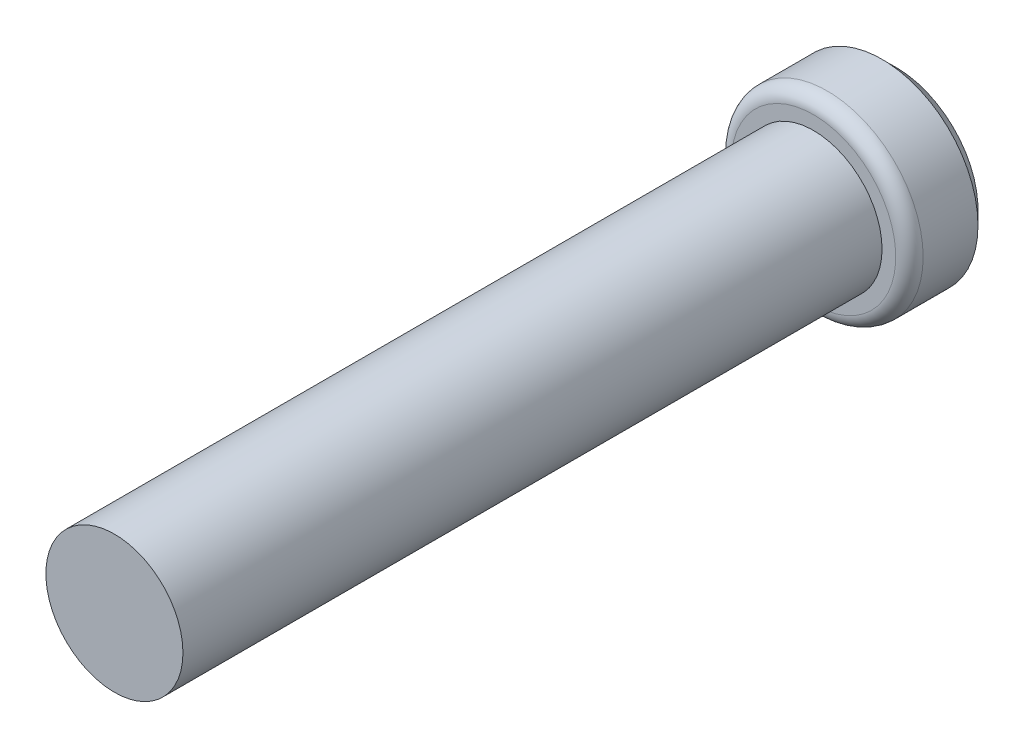
ISO-10303-21;
HEADER;
FILE_DESCRIPTION(('STEP AP214'),'2;1');
FILE_NAME('part.step','',(''),(''),'','','');
FILE_SCHEMA(('AUTOMOTIVE_DESIGN { 1 0 10303 214 1 1 1 1 }'));
ENDSEC;
DATA;
#1=APPLICATION_CONTEXT('core data for automotive mechanical design processes');
#2=APPLICATION_PROTOCOL_DEFINITION('international standard','automotive_design',2000,#1);
#3=PRODUCT_CONTEXT('',#1,'mechanical');
#4=PRODUCT('Part','Part','',(#3));
#5=PRODUCT_RELATED_PRODUCT_CATEGORY('part','',(#4));
#6=PRODUCT_DEFINITION_FORMATION('','',#4);
#7=PRODUCT_DEFINITION_CONTEXT('part definition',#1,'design');
#8=PRODUCT_DEFINITION('design','',#6,#7);
#9=PRODUCT_DEFINITION_SHAPE('','',#8);
#10=(LENGTH_UNIT() NAMED_UNIT(*) SI_UNIT(.MILLI.,.METRE.));
#11=(NAMED_UNIT(*) PLANE_ANGLE_UNIT() SI_UNIT($,.RADIAN.));
#12=(NAMED_UNIT(*) SI_UNIT($,.STERADIAN.) SOLID_ANGLE_UNIT());
#13=UNCERTAINTY_MEASURE_WITH_UNIT(LENGTH_MEASURE(1.E-05),#10,'distance_accuracy_value','');
#14=(GEOMETRIC_REPRESENTATION_CONTEXT(3) GLOBAL_UNCERTAINTY_ASSIGNED_CONTEXT((#13)) GLOBAL_UNIT_ASSIGNED_CONTEXT((#10,
#11,#12)) REPRESENTATION_CONTEXT('',''));
#15=CARTESIAN_POINT('',(0.,0.,0.));
#16=DIRECTION('',(0.,0.,1.));
#17=DIRECTION('',(1.,0.,0.));
#18=AXIS2_PLACEMENT_3D('',#15,#16,#17);
#19=CARTESIAN_POINT('',(0.,0.,25.5));
#20=DIRECTION('',(0.,0.,-1.));
#21=DIRECTION('',(-1.,0.,0.));
#22=AXIS2_PLACEMENT_3D('',#19,#20,#21);
#23=CYLINDRICAL_SURFACE('',#22,2.5);
#24=CARTESIAN_POINT('',(0.,0.,25.5));
#25=DIRECTION('',(0.,0.,1.));
#26=DIRECTION('',(1.,0.,0.));
#27=AXIS2_PLACEMENT_3D('',#24,#25,#26);
#28=CIRCLE('',#27,2.5);
#29=CARTESIAN_POINT('',(2.5,0.,25.5));
#30=VERTEX_POINT('',#29);
#31=EDGE_CURVE('E144',#30,#30,#28,.T.);
#32=ORIENTED_EDGE('',*,*,#31,.F.);
#33=EDGE_LOOP('',(#32));
#34=FACE_BOUND('',#33,.T.);
#35=CARTESIAN_POINT('',(0.,0.,0.));
#36=DIRECTION('',(0.,0.,1.));
#37=DIRECTION('',(1.,0.,0.));
#38=AXIS2_PLACEMENT_3D('',#35,#36,#37);
#39=CIRCLE('',#38,2.5);
#40=CARTESIAN_POINT('',(2.5,0.,0.));
#41=VERTEX_POINT('',#40);
#42=EDGE_CURVE('E138',#41,#41,#39,.T.);
#43=ORIENTED_EDGE('',*,*,#42,.T.);
#44=EDGE_LOOP('',(#43));
#45=FACE_BOUND('',#44,.T.);
#46=ADVANCED_FACE('F36',(#34,#45),#23,.T.);
#47=CARTESIAN_POINT('',(0.,0.,25.5));
#48=DIRECTION('',(0.,0.,1.));
#49=DIRECTION('',(1.,0.,0.));
#50=AXIS2_PLACEMENT_3D('',#47,#48,#49);
#51=PLANE('',#50);
#52=ORIENTED_EDGE('',*,*,#31,.T.);
#53=EDGE_LOOP('',(#52));
#54=FACE_BOUND('',#53,.T.);
#55=ADVANCED_FACE('F169',(#54),#51,.T.);
#56=CARTESIAN_POINT('',(0.,0.,-3.));
#57=DIRECTION('',(0.,0.,1.));
#58=DIRECTION('',(1.,0.,0.));
#59=AXIS2_PLACEMENT_3D('',#56,#57,#58);
#60=CYLINDRICAL_SURFACE('',#59,3.5);
#61=CARTESIAN_POINT('',(0.,0.,-0.5));
#62=DIRECTION('',(0.,0.,-1.));
#63=DIRECTION('',(-1.,0.,0.));
#64=AXIS2_PLACEMENT_3D('',#61,#62,#63);
#65=CIRCLE('',#64,3.5);
#66=CARTESIAN_POINT('',(-3.5,0.,-0.5));
#67=VERTEX_POINT('',#66);
#68=EDGE_CURVE('E44',#67,#67,#65,.T.);
#69=ORIENTED_EDGE('',*,*,#68,.T.);
#70=EDGE_LOOP('',(#69));
#71=FACE_BOUND('',#70,.T.);
#72=CARTESIAN_POINT('',(0.,0.,-2.5));
#73=DIRECTION('',(0.,0.,-1.));
#74=DIRECTION('',(-1.,0.,0.));
#75=AXIS2_PLACEMENT_3D('',#72,#73,#74);
#76=CIRCLE('',#75,3.5);
#77=CARTESIAN_POINT('',(-3.5,0.,-2.5));
#78=VERTEX_POINT('',#77);
#79=EDGE_CURVE('E152',#78,#78,#76,.F.);
#80=ORIENTED_EDGE('',*,*,#79,.T.);
#81=EDGE_LOOP('',(#80));
#82=FACE_BOUND('',#81,.T.);
#83=ADVANCED_FACE('F157',(#71,#82),#60,.T.);
#84=CARTESIAN_POINT('',(0.,0.,-3.));
#85=DIRECTION('',(0.,0.,-1.));
#86=DIRECTION('',(-1.,0.,0.));
#87=AXIS2_PLACEMENT_3D('',#84,#85,#86);
#88=PLANE('',#87);
#89=CARTESIAN_POINT('',(0.,0.,-3.));
#90=DIRECTION('',(0.,0.,-1.));
#91=DIRECTION('',(-1.,0.,0.));
#92=AXIS2_PLACEMENT_3D('',#89,#90,#91);
#93=CIRCLE('',#92,3.);
#94=CARTESIAN_POINT('',(-3.,0.,-3.));
#95=VERTEX_POINT('',#94);
#96=EDGE_CURVE('E147',#95,#95,#93,.T.);
#97=ORIENTED_EDGE('',*,*,#96,.T.);
#98=EDGE_LOOP('',(#97));
#99=FACE_BOUND('',#98,.T.);
#100=DIRECTION('',(-0.866025403784436,0.500000000000004,0.));
#101=VECTOR('',#100,1.);
#102=CARTESIAN_POINT('',(-1.09002923180361,-1.8879860112191,-3.));
#103=LINE('',#102,#101);
#104=CARTESIAN_POINT('',(0.,-2.51731468162548,-3.));
#105=VERTEX_POINT('',#104);
#106=CARTESIAN_POINT('',(-2.18005846360722,-1.25865734081272,-3.));
#107=VERTEX_POINT('',#106);
#108=EDGE_CURVE('E51',#105,#107,#103,.T.);
#109=ORIENTED_EDGE('',*,*,#108,.F.);
#110=DIRECTION('',(-0.86602540378444,-0.499999999999998,0.));
#111=VECTOR('',#110,1.);
#112=CARTESIAN_POINT('',(1.0900292318036,-1.88798601121912,-3.));
#113=LINE('',#112,#111);
#114=CARTESIAN_POINT('',(2.1800584636072,-1.25865734081275,-3.));
#115=VERTEX_POINT('',#114);
#116=EDGE_CURVE('E134',#115,#105,#113,.T.);
#117=ORIENTED_EDGE('',*,*,#116,.F.);
#118=DIRECTION('',(0.,-1.,0.));
#119=VECTOR('',#118,1.);
#120=CARTESIAN_POINT('',(2.1800584636072,0.,-3.));
#121=LINE('',#120,#119);
#122=CARTESIAN_POINT('',(2.18005846360721,1.25865734081274,-3.));
#123=VERTEX_POINT('',#122);
#124=EDGE_CURVE('E132',#123,#115,#121,.T.);
#125=ORIENTED_EDGE('',*,*,#124,.F.);
#126=DIRECTION('',(0.866025403784438,-0.500000000000001,0.));
#127=VECTOR('',#126,1.);
#128=CARTESIAN_POINT('',(1.0900292318036,1.88798601121911,-3.));
#129=LINE('',#128,#127);
#130=CARTESIAN_POINT('',(0.,2.51731468162548,-3.));
#131=VERTEX_POINT('',#130);
#132=EDGE_CURVE('E99',#131,#123,#129,.T.);
#133=ORIENTED_EDGE('',*,*,#132,.F.);
#134=DIRECTION('',(0.866025403784441,0.499999999999995,0.));
#135=VECTOR('',#134,1.);
#136=CARTESIAN_POINT('',(-1.0900292318036,1.88798601121912,-3.));
#137=LINE('',#136,#135);
#138=CARTESIAN_POINT('',(-2.18005846360719,1.25865734081277,-3.));
#139=VERTEX_POINT('',#138);
#140=EDGE_CURVE('E128',#139,#131,#137,.T.);
#141=ORIENTED_EDGE('',*,*,#140,.F.);
#142=DIRECTION('',(0.,1.,0.));
#143=VECTOR('',#142,1.);
#144=CARTESIAN_POINT('',(-2.1800584636072,0.,-3.));
#145=LINE('',#144,#143);
#146=EDGE_CURVE('E125',#107,#139,#145,.T.);
#147=ORIENTED_EDGE('',*,*,#146,.F.);
#148=EDGE_LOOP('',(#109,#117,#125,#133,#141,#147));
#149=FACE_BOUND('',#148,.T.);
#150=ADVANCED_FACE('F185',(#99,#149),#88,.T.);
#151=CARTESIAN_POINT('',(0.,0.,0.));
#152=DIRECTION('',(0.,0.,-1.));
#153=DIRECTION('',(-1.,0.,0.));
#154=AXIS2_PLACEMENT_3D('',#151,#152,#153);
#155=PLANE('',#154);
#156=CARTESIAN_POINT('',(0.,0.,0.));
#157=DIRECTION('',(0.,0.,-1.));
#158=DIRECTION('',(-1.,0.,0.));
#159=AXIS2_PLACEMENT_3D('',#156,#157,#158);
#160=CIRCLE('',#159,3.);
#161=CARTESIAN_POINT('',(-3.,0.,0.));
#162=VERTEX_POINT('',#161);
#163=EDGE_CURVE('E11',#162,#162,#160,.F.);
#164=ORIENTED_EDGE('',*,*,#163,.T.);
#165=EDGE_LOOP('',(#164));
#166=FACE_BOUND('',#165,.T.);
#167=ORIENTED_EDGE('',*,*,#42,.F.);
#168=EDGE_LOOP('',(#167));
#169=FACE_BOUND('',#168,.T.);
#170=ADVANCED_FACE('F186',(#166,#169),#155,.F.);
#171=CARTESIAN_POINT('',(-1.09002923180361,-1.8879860112191,-1.));
#172=DIRECTION('',(-0.500000000000004,-0.866025403784436,0.));
#173=DIRECTION('',(0.866025403784436,-0.500000000000004,0.));
#174=AXIS2_PLACEMENT_3D('',#171,#172,#173);
#175=PLANE('',#174);
#176=ORIENTED_EDGE('',*,*,#108,.T.);
#177=DIRECTION('',(0.,0.,-1.));
#178=VECTOR('',#177,1.);
#179=CARTESIAN_POINT('',(-2.18005846360722,-1.25865734081272,-1.));
#180=LINE('',#179,#178);
#181=CARTESIAN_POINT('',(-2.18005846360722,-1.25865734081272,-1.));
#182=VERTEX_POINT('',#181);
#183=EDGE_CURVE('E81',#182,#107,#180,.T.);
#184=ORIENTED_EDGE('',*,*,#183,.F.);
#185=DIRECTION('',(-0.866025403784436,0.500000000000004,0.));
#186=VECTOR('',#185,1.);
#187=CARTESIAN_POINT('',(-1.09002923180361,-1.8879860112191,-1.));
#188=LINE('',#187,#186);
#189=CARTESIAN_POINT('',(0.,-2.51731468162548,-1.));
#190=VERTEX_POINT('',#189);
#191=EDGE_CURVE('E136',#190,#182,#188,.T.);
#192=ORIENTED_EDGE('',*,*,#191,.F.);
#193=DIRECTION('',(0.,0.,-1.));
#194=VECTOR('',#193,1.);
#195=CARTESIAN_POINT('',(0.,-2.51731468162548,-1.));
#196=LINE('',#195,#194);
#197=EDGE_CURVE('E59',#190,#105,#196,.T.);
#198=ORIENTED_EDGE('',*,*,#197,.T.);
#199=EDGE_LOOP('',(#176,#184,#192,#198));
#200=FACE_BOUND('',#199,.T.);
#201=ADVANCED_FACE('F189',(#200),#175,.F.);
#202=CARTESIAN_POINT('',(1.0900292318036,-1.88798601121912,-1.));
#203=DIRECTION('',(0.499999999999998,-0.86602540378444,0.));
#204=DIRECTION('',(0.86602540378444,0.499999999999998,0.));
#205=AXIS2_PLACEMENT_3D('',#202,#203,#204);
#206=PLANE('',#205);
#207=ORIENTED_EDGE('',*,*,#116,.T.);
#208=ORIENTED_EDGE('',*,*,#197,.F.);
#209=DIRECTION('',(-0.86602540378444,-0.499999999999998,0.));
#210=VECTOR('',#209,1.);
#211=CARTESIAN_POINT('',(1.0900292318036,-1.88798601121912,-1.));
#212=LINE('',#211,#210);
#213=CARTESIAN_POINT('',(2.1800584636072,-1.25865734081275,-1.));
#214=VERTEX_POINT('',#213);
#215=EDGE_CURVE('E111',#214,#190,#212,.T.);
#216=ORIENTED_EDGE('',*,*,#215,.F.);
#217=DIRECTION('',(0.,0.,-1.));
#218=VECTOR('',#217,1.);
#219=CARTESIAN_POINT('',(2.1800584636072,-1.25865734081275,-1.));
#220=LINE('',#219,#218);
#221=EDGE_CURVE('E103',#214,#115,#220,.T.);
#222=ORIENTED_EDGE('',*,*,#221,.T.);
#223=EDGE_LOOP('',(#207,#208,#216,#222));
#224=FACE_BOUND('',#223,.T.);
#225=ADVANCED_FACE('F196',(#224),#206,.F.);
#226=CARTESIAN_POINT('',(2.1800584636072,0.,-1.));
#227=DIRECTION('',(1.,0.,0.));
#228=DIRECTION('',(0.,1.,0.));
#229=AXIS2_PLACEMENT_3D('',#226,#227,#228);
#230=PLANE('',#229);
#231=ORIENTED_EDGE('',*,*,#124,.T.);
#232=ORIENTED_EDGE('',*,*,#221,.F.);
#233=DIRECTION('',(0.,-1.,0.));
#234=VECTOR('',#233,1.);
#235=CARTESIAN_POINT('',(2.1800584636072,0.,-1.));
#236=LINE('',#235,#234);
#237=CARTESIAN_POINT('',(2.18005846360721,1.25865734081274,-1.));
#238=VERTEX_POINT('',#237);
#239=EDGE_CURVE('E107',#238,#214,#236,.T.);
#240=ORIENTED_EDGE('',*,*,#239,.F.);
#241=DIRECTION('',(0.,0.,-1.));
#242=VECTOR('',#241,1.);
#243=CARTESIAN_POINT('',(2.18005846360721,1.25865734081274,-1.));
#244=LINE('',#243,#242);
#245=EDGE_CURVE('E92',#238,#123,#244,.T.);
#246=ORIENTED_EDGE('',*,*,#245,.T.);
#247=EDGE_LOOP('',(#231,#232,#240,#246));
#248=FACE_BOUND('',#247,.T.);
#249=ADVANCED_FACE('F108',(#248),#230,.F.);
#250=CARTESIAN_POINT('',(1.0900292318036,1.88798601121911,-1.));
#251=DIRECTION('',(0.500000000000001,0.866025403784438,0.));
#252=DIRECTION('',(-0.866025403784438,0.500000000000001,0.));
#253=AXIS2_PLACEMENT_3D('',#250,#251,#252);
#254=PLANE('',#253);
#255=ORIENTED_EDGE('',*,*,#132,.T.);
#256=ORIENTED_EDGE('',*,*,#245,.F.);
#257=DIRECTION('',(0.866025403784438,-0.500000000000001,0.));
#258=VECTOR('',#257,1.);
#259=CARTESIAN_POINT('',(1.0900292318036,1.88798601121911,-1.));
#260=LINE('',#259,#258);
#261=CARTESIAN_POINT('',(0.,2.51731468162548,-1.));
#262=VERTEX_POINT('',#261);
#263=EDGE_CURVE('E96',#262,#238,#260,.T.);
#264=ORIENTED_EDGE('',*,*,#263,.F.);
#265=DIRECTION('',(0.,0.,-1.));
#266=VECTOR('',#265,1.);
#267=CARTESIAN_POINT('',(0.,2.51731468162548,-1.));
#268=LINE('',#267,#266);
#269=EDGE_CURVE('E104',#262,#131,#268,.T.);
#270=ORIENTED_EDGE('',*,*,#269,.T.);
#271=EDGE_LOOP('',(#255,#256,#264,#270));
#272=FACE_BOUND('',#271,.T.);
#273=ADVANCED_FACE('F94',(#272),#254,.F.);
#274=CARTESIAN_POINT('',(-1.0900292318036,1.88798601121912,-1.));
#275=DIRECTION('',(-0.499999999999995,0.866025403784441,0.));
#276=DIRECTION('',(-0.866025403784442,-0.499999999999995,0.));
#277=AXIS2_PLACEMENT_3D('',#274,#275,#276);
#278=PLANE('',#277);
#279=ORIENTED_EDGE('',*,*,#140,.T.);
#280=ORIENTED_EDGE('',*,*,#269,.F.);
#281=DIRECTION('',(0.866025403784441,0.499999999999995,0.));
#282=VECTOR('',#281,1.);
#283=CARTESIAN_POINT('',(-1.0900292318036,1.88798601121912,-1.));
#284=LINE('',#283,#282);
#285=CARTESIAN_POINT('',(-2.18005846360719,1.25865734081277,-1.));
#286=VERTEX_POINT('',#285);
#287=EDGE_CURVE('E117',#286,#262,#284,.T.);
#288=ORIENTED_EDGE('',*,*,#287,.F.);
#289=DIRECTION('',(0.,0.,-1.));
#290=VECTOR('',#289,1.);
#291=CARTESIAN_POINT('',(-2.18005846360719,1.25865734081277,-1.));
#292=LINE('',#291,#290);
#293=EDGE_CURVE('E141',#286,#139,#292,.T.);
#294=ORIENTED_EDGE('',*,*,#293,.T.);
#295=EDGE_LOOP('',(#279,#280,#288,#294));
#296=FACE_BOUND('',#295,.T.);
#297=ADVANCED_FACE('F200',(#296),#278,.F.);
#298=CARTESIAN_POINT('',(-2.1800584636072,0.,-1.));
#299=DIRECTION('',(-1.,0.,0.));
#300=DIRECTION('',(0.,-1.,0.));
#301=AXIS2_PLACEMENT_3D('',#298,#299,#300);
#302=PLANE('',#301);
#303=ORIENTED_EDGE('',*,*,#146,.T.);
#304=ORIENTED_EDGE('',*,*,#293,.F.);
#305=DIRECTION('',(0.,1.,0.));
#306=VECTOR('',#305,1.);
#307=CARTESIAN_POINT('',(-2.1800584636072,0.,-1.));
#308=LINE('',#307,#306);
#309=EDGE_CURVE('E119',#182,#286,#308,.T.);
#310=ORIENTED_EDGE('',*,*,#309,.F.);
#311=ORIENTED_EDGE('',*,*,#183,.T.);
#312=EDGE_LOOP('',(#303,#304,#310,#311));
#313=FACE_BOUND('',#312,.T.);
#314=ADVANCED_FACE('F197',(#313),#302,.F.);
#315=CARTESIAN_POINT('',(0.,0.,-1.));
#316=DIRECTION('',(0.,0.,-1.));
#317=DIRECTION('',(-1.,0.,0.));
#318=AXIS2_PLACEMENT_3D('',#315,#316,#317);
#319=PLANE('',#318);
#320=ORIENTED_EDGE('',*,*,#191,.T.);
#321=ORIENTED_EDGE('',*,*,#309,.T.);
#322=ORIENTED_EDGE('',*,*,#287,.T.);
#323=ORIENTED_EDGE('',*,*,#263,.T.);
#324=ORIENTED_EDGE('',*,*,#239,.T.);
#325=ORIENTED_EDGE('',*,*,#215,.T.);
#326=EDGE_LOOP('',(#320,#321,#322,#323,#324,#325));
#327=FACE_BOUND('',#326,.T.);
#328=ADVANCED_FACE('F114',(#327),#319,.T.);
#329=CARTESIAN_POINT('',(0.,0.,-3.));
#330=DIRECTION('',(0.,0.,1.));
#331=DIRECTION('',(1.,0.,0.));
#332=AXIS2_PLACEMENT_3D('',#329,#330,#331);
#333=CONICAL_SURFACE('',#332,3.,0.785398163397447);
#334=ORIENTED_EDGE('',*,*,#79,.F.);
#335=EDGE_LOOP('',(#334));
#336=FACE_BOUND('',#335,.T.);
#337=ORIENTED_EDGE('',*,*,#96,.F.);
#338=EDGE_LOOP('',(#337));
#339=FACE_BOUND('',#338,.T.);
#340=ADVANCED_FACE('F161',(#336,#339),#333,.T.);
#341=CARTESIAN_POINT('',(0.,0.,-0.5));
#342=DIRECTION('',(0.,0.,-1.));
#343=DIRECTION('',(-1.,0.,0.));
#344=AXIS2_PLACEMENT_3D('',#341,#342,#343);
#345=TOROIDAL_SURFACE('',#344,3.,0.5);
#346=ORIENTED_EDGE('',*,*,#163,.F.);
#347=EDGE_LOOP('',(#346));
#348=FACE_BOUND('',#347,.T.);
#349=ORIENTED_EDGE('',*,*,#68,.F.);
#350=EDGE_LOOP('',(#349));
#351=FACE_BOUND('',#350,.T.);
#352=ADVANCED_FACE('F38',(#348,#351),#345,.T.);
#353=CLOSED_SHELL('',(#46,#55,#83,#150,#170,#201,#225,#249,#273,#297,#314,#328,#340,#352));
#354=MANIFOLD_SOLID_BREP('B2',#353);
#355=ADVANCED_BREP_SHAPE_REPRESENTATION('',(#18,#354),#14);
#356=SHAPE_DEFINITION_REPRESENTATION(#9,#355);
ENDSEC;
END-ISO-10303-21;
